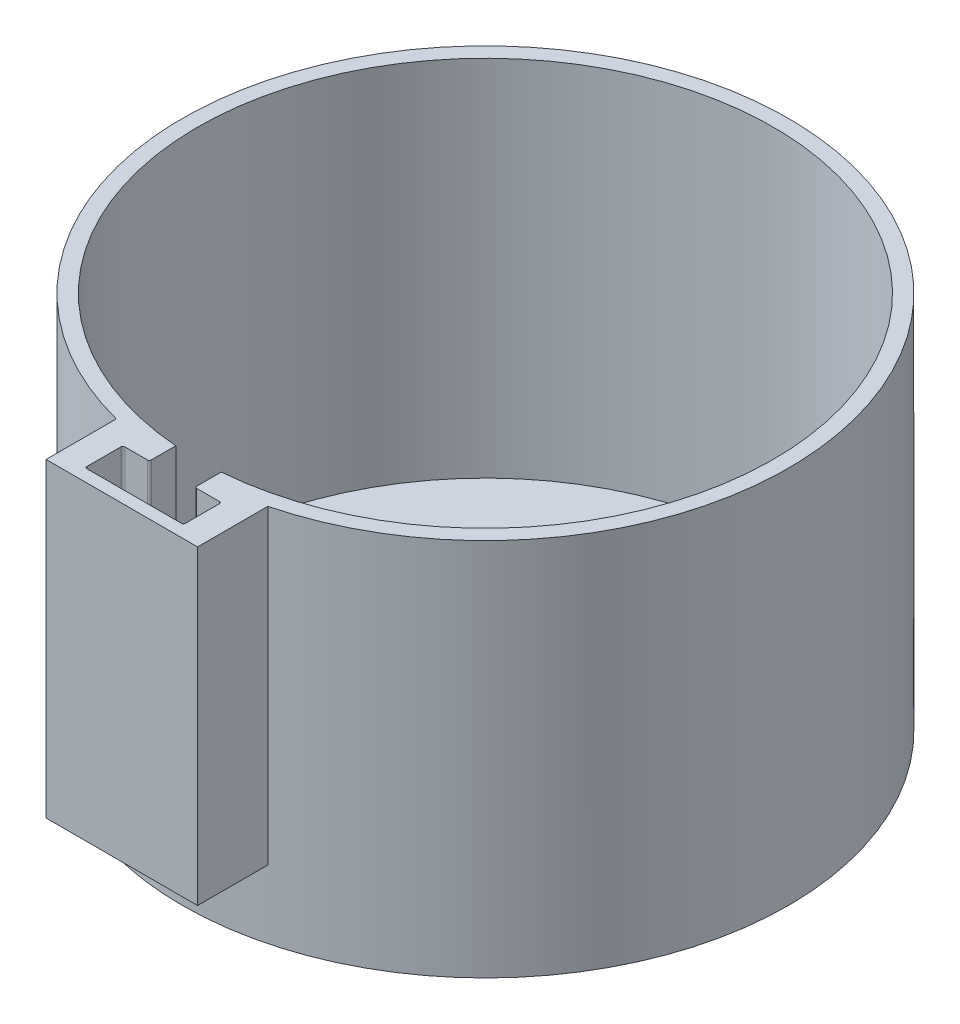
ISO-10303-21;
HEADER;
FILE_DESCRIPTION(('STEP AP214'),'2;1');
FILE_NAME('part.step','',(''),(''),'','','');
FILE_SCHEMA(('AUTOMOTIVE_DESIGN { 1 0 10303 214 1 1 1 1 }'));
ENDSEC;
DATA;
#1=APPLICATION_CONTEXT('core data for automotive mechanical design processes');
#2=APPLICATION_PROTOCOL_DEFINITION('international standard','automotive_design',2000,#1);
#3=PRODUCT_CONTEXT('',#1,'mechanical');
#4=PRODUCT('Part','Part','',(#3));
#5=PRODUCT_RELATED_PRODUCT_CATEGORY('part','',(#4));
#6=PRODUCT_DEFINITION_FORMATION('','',#4);
#7=PRODUCT_DEFINITION_CONTEXT('part definition',#1,'design');
#8=PRODUCT_DEFINITION('design','',#6,#7);
#9=PRODUCT_DEFINITION_SHAPE('','',#8);
#10=(LENGTH_UNIT() NAMED_UNIT(*) SI_UNIT(.MILLI.,.METRE.));
#11=(NAMED_UNIT(*) PLANE_ANGLE_UNIT() SI_UNIT($,.RADIAN.));
#12=(NAMED_UNIT(*) SI_UNIT($,.STERADIAN.) SOLID_ANGLE_UNIT());
#13=UNCERTAINTY_MEASURE_WITH_UNIT(LENGTH_MEASURE(1.E-05),#10,'distance_accuracy_value','');
#14=(GEOMETRIC_REPRESENTATION_CONTEXT(3) GLOBAL_UNCERTAINTY_ASSIGNED_CONTEXT((#13)) GLOBAL_UNIT_ASSIGNED_CONTEXT((#10,
#11,#12)) REPRESENTATION_CONTEXT('',''));
#15=CARTESIAN_POINT('',(0.,0.,0.));
#16=DIRECTION('',(0.,0.,1.));
#17=DIRECTION('',(1.,0.,0.));
#18=AXIS2_PLACEMENT_3D('',#15,#16,#17);
#19=CARTESIAN_POINT('',(0.,40.,0.));
#20=DIRECTION('',(0.,-1.,0.));
#21=DIRECTION('',(0.,0.,-1.));
#22=AXIS2_PLACEMENT_3D('',#19,#20,#21);
#23=CYLINDRICAL_SURFACE('',#22,40.);
#24=CARTESIAN_POINT('',(0.,0.,0.));
#25=DIRECTION('',(0.,1.,0.));
#26=DIRECTION('',(0.,0.,1.));
#27=AXIS2_PLACEMENT_3D('',#24,#25,#26);
#28=CIRCLE('',#27,40.);
#29=CARTESIAN_POINT('',(0.,0.,40.));
#30=VERTEX_POINT('',#29);
#31=EDGE_CURVE('E261',#30,#30,#28,.T.);
#32=ORIENTED_EDGE('',*,*,#31,.T.);
#33=EDGE_LOOP('',(#32));
#34=FACE_BOUND('',#33,.T.);
#35=DIRECTION('',(0.,-1.,0.));
#36=VECTOR('',#35,1.);
#37=CARTESIAN_POINT('',(10.,40.,38.7298334620742));
#38=LINE('',#37,#36);
#39=CARTESIAN_POINT('',(10.,9.,38.7298334620742));
#40=VERTEX_POINT('',#39);
#41=CARTESIAN_POINT('',(10.,50.,38.7298334620742));
#42=VERTEX_POINT('',#41);
#43=EDGE_CURVE('E228',#40,#42,#38,.F.);
#44=ORIENTED_EDGE('',*,*,#43,.F.);
#45=CARTESIAN_POINT('',(0.,9.,0.));
#46=DIRECTION('',(0.,-1.,0.));
#47=DIRECTION('',(0.,0.,-1.));
#48=AXIS2_PLACEMENT_3D('',#45,#46,#47);
#49=CIRCLE('',#48,40.);
#50=CARTESIAN_POINT('',(-9.99999999999999,9.,38.7298334620742));
#51=VERTEX_POINT('',#50);
#52=EDGE_CURVE('E220',#40,#51,#49,.T.);
#53=ORIENTED_EDGE('',*,*,#52,.T.);
#54=DIRECTION('',(0.,-1.,0.));
#55=VECTOR('',#54,1.);
#56=CARTESIAN_POINT('',(-9.99999999999999,40.,38.7298334620742));
#57=LINE('',#56,#55);
#58=CARTESIAN_POINT('',(-9.99999999999999,50.,38.7298334620742));
#59=VERTEX_POINT('',#58);
#60=EDGE_CURVE('E443',#51,#59,#57,.F.);
#61=ORIENTED_EDGE('',*,*,#60,.T.);
#62=CARTESIAN_POINT('',(0.,50.,0.));
#63=DIRECTION('',(0.,1.,0.));
#64=DIRECTION('',(0.,0.,1.));
#65=AXIS2_PLACEMENT_3D('',#62,#63,#64);
#66=CIRCLE('',#65,40.);
#67=EDGE_CURVE('E219',#42,#59,#66,.T.);
#68=ORIENTED_EDGE('',*,*,#67,.F.);
#69=EDGE_LOOP('',(#44,#53,#61,#68));
#70=FACE_BOUND('',#69,.T.);
#71=ADVANCED_FACE('F45',(#34,#70),#23,.T.);
#72=CARTESIAN_POINT('',(0.,0.,0.));
#73=DIRECTION('',(0.,1.,0.));
#74=DIRECTION('',(0.,0.,1.));
#75=AXIS2_PLACEMENT_3D('',#72,#73,#74);
#76=PLANE('',#75);
#77=CARTESIAN_POINT('',(-30.,0.,0.));
#78=DIRECTION('',(0.,-1.,0.));
#79=DIRECTION('',(0.,0.,-1.));
#80=AXIS2_PLACEMENT_3D('',#77,#78,#79);
#81=CIRCLE('',#80,3.);
#82=CARTESIAN_POINT('',(-30.,0.,-3.));
#83=VERTEX_POINT('',#82);
#84=EDGE_CURVE('E357',#83,#83,#81,.T.);
#85=ORIENTED_EDGE('',*,*,#84,.F.);
#86=EDGE_LOOP('',(#85));
#87=FACE_BOUND('',#86,.T.);
#88=CARTESIAN_POINT('',(30.,0.,0.));
#89=DIRECTION('',(0.,-1.,0.));
#90=DIRECTION('',(0.,0.,-1.));
#91=AXIS2_PLACEMENT_3D('',#88,#89,#90);
#92=CIRCLE('',#91,3.);
#93=CARTESIAN_POINT('',(30.,0.,-3.));
#94=VERTEX_POINT('',#93);
#95=EDGE_CURVE('E365',#94,#94,#92,.T.);
#96=ORIENTED_EDGE('',*,*,#95,.F.);
#97=EDGE_LOOP('',(#96));
#98=FACE_BOUND('',#97,.T.);
#99=CARTESIAN_POINT('',(-20.,0.,0.));
#100=DIRECTION('',(0.,1.,0.));
#101=DIRECTION('',(0.,0.,1.));
#102=AXIS2_PLACEMENT_3D('',#99,#100,#101);
#103=CIRCLE('',#102,2.);
#104=CARTESIAN_POINT('',(-20.,0.,2.));
#105=VERTEX_POINT('',#104);
#106=EDGE_CURVE('E277',#105,#105,#103,.F.);
#107=ORIENTED_EDGE('',*,*,#106,.F.);
#108=EDGE_LOOP('',(#107));
#109=FACE_BOUND('',#108,.T.);
#110=CARTESIAN_POINT('',(20.,0.,0.));
#111=DIRECTION('',(0.,1.,0.));
#112=DIRECTION('',(0.,0.,1.));
#113=AXIS2_PLACEMENT_3D('',#110,#111,#112);
#114=CIRCLE('',#113,2.);
#115=CARTESIAN_POINT('',(20.,0.,2.));
#116=VERTEX_POINT('',#115);
#117=EDGE_CURVE('E273',#116,#116,#114,.F.);
#118=ORIENTED_EDGE('',*,*,#117,.F.);
#119=EDGE_LOOP('',(#118));
#120=FACE_BOUND('',#119,.T.);
#121=CARTESIAN_POINT('',(0.,0.,0.));
#122=DIRECTION('',(0.,1.,0.));
#123=DIRECTION('',(0.,0.,1.));
#124=AXIS2_PLACEMENT_3D('',#121,#122,#123);
#125=CIRCLE('',#124,5.);
#126=CARTESIAN_POINT('',(0.,0.,5.));
#127=VERTEX_POINT('',#126);
#128=EDGE_CURVE('E243',#127,#127,#125,.T.);
#129=ORIENTED_EDGE('',*,*,#128,.T.);
#130=EDGE_LOOP('',(#129));
#131=FACE_BOUND('',#130,.T.);
#132=CARTESIAN_POINT('',(0.,0.,39.1212194390183));
#133=DIRECTION('',(0.,1.,0.));
#134=DIRECTION('',(0.,0.,1.));
#135=AXIS2_PLACEMENT_3D('',#132,#133,#134);
#136=CIRCLE('',#135,14.5863569862894);
#137=CARTESIAN_POINT('',(14.0760667026475,0.,35.296803625578));
#138=VERTEX_POINT('',#137);
#139=CARTESIAN_POINT('',(-14.0760667026475,0.,35.296803625578));
#140=VERTEX_POINT('',#139);
#141=EDGE_CURVE('E265',#138,#140,#136,.T.);
#142=ORIENTED_EDGE('',*,*,#141,.T.);
#143=CARTESIAN_POINT('',(0.,0.,4.02455846426619E-13));
#144=DIRECTION('',(0.,1.,0.));
#145=DIRECTION('',(0.,0.,1.));
#146=AXIS2_PLACEMENT_3D('',#143,#144,#145);
#147=CIRCLE('',#146,37.9999999999996);
#148=EDGE_CURVE('E269',#140,#138,#147,.T.);
#149=ORIENTED_EDGE('',*,*,#148,.T.);
#150=EDGE_LOOP('',(#142,#149));
#151=FACE_BOUND('',#150,.T.);
#152=ORIENTED_EDGE('',*,*,#31,.F.);
#153=EDGE_LOOP('',(#152));
#154=FACE_BOUND('',#153,.T.);
#155=ADVANCED_FACE('F476',(#87,#98,#109,#120,#131,#151,#154),#76,.F.);
#156=CARTESIAN_POINT('',(0.,2.,0.));
#157=DIRECTION('',(0.,1.,0.));
#158=DIRECTION('',(0.,0.,1.));
#159=AXIS2_PLACEMENT_3D('',#156,#157,#158);
#160=CYLINDRICAL_SURFACE('',#159,38.);
#161=CARTESIAN_POINT('',(0.,50.,0.));
#162=DIRECTION('',(0.,1.,0.));
#163=DIRECTION('',(0.,0.,1.));
#164=AXIS2_PLACEMENT_3D('',#161,#162,#163);
#165=CIRCLE('',#164,38.);
#166=CARTESIAN_POINT('',(3.,50.,37.8813938497516));
#167=VERTEX_POINT('',#166);
#168=CARTESIAN_POINT('',(-3.,50.,37.8813938497516));
#169=VERTEX_POINT('',#168);
#170=EDGE_CURVE('E206',#167,#169,#165,.T.);
#171=ORIENTED_EDGE('',*,*,#170,.T.);
#172=DIRECTION('',(0.,1.,0.));
#173=VECTOR('',#172,1.);
#174=CARTESIAN_POINT('',(-3.,2.,37.8813938497516));
#175=LINE('',#174,#173);
#176=CARTESIAN_POINT('',(-3.,11.,37.8813938497516));
#177=VERTEX_POINT('',#176);
#178=EDGE_CURVE('E209',#169,#177,#175,.F.);
#179=ORIENTED_EDGE('',*,*,#178,.T.);
#180=CARTESIAN_POINT('',(0.,11.,0.));
#181=DIRECTION('',(0.,-1.,0.));
#182=DIRECTION('',(0.,0.,-1.));
#183=AXIS2_PLACEMENT_3D('',#180,#181,#182);
#184=CIRCLE('',#183,38.);
#185=CARTESIAN_POINT('',(3.,11.,37.8813938497516));
#186=VERTEX_POINT('',#185);
#187=EDGE_CURVE('E207',#177,#186,#184,.F.);
#188=ORIENTED_EDGE('',*,*,#187,.T.);
#189=DIRECTION('',(0.,1.,0.));
#190=VECTOR('',#189,1.);
#191=CARTESIAN_POINT('',(3.,2.,37.8813938497516));
#192=LINE('',#191,#190);
#193=EDGE_CURVE('E191',#186,#167,#192,.T.);
#194=ORIENTED_EDGE('',*,*,#193,.T.);
#195=EDGE_LOOP('',(#171,#179,#188,#194));
#196=FACE_BOUND('',#195,.T.);
#197=CARTESIAN_POINT('',(0.,2.,0.));
#198=DIRECTION('',(0.,1.,0.));
#199=DIRECTION('',(0.,0.,1.));
#200=AXIS2_PLACEMENT_3D('',#197,#198,#199);
#201=CIRCLE('',#200,38.);
#202=CARTESIAN_POINT('',(14.0760667026475,2.,35.296803625578));
#203=VERTEX_POINT('',#202);
#204=CARTESIAN_POINT('',(-14.0760667026475,2.,35.296803625578));
#205=VERTEX_POINT('',#204);
#206=EDGE_CURVE('E255',#203,#205,#201,.T.);
#207=ORIENTED_EDGE('',*,*,#206,.F.);
#208=DIRECTION('',(0.,1.,0.));
#209=VECTOR('',#208,1.);
#210=CARTESIAN_POINT('',(14.0760667026475,-36.,35.296803625578));
#211=LINE('',#210,#209);
#212=EDGE_CURVE('E251',#138,#203,#211,.T.);
#213=ORIENTED_EDGE('',*,*,#212,.F.);
#214=ORIENTED_EDGE('',*,*,#148,.F.);
#215=DIRECTION('',(0.,1.,0.));
#216=VECTOR('',#215,1.);
#217=CARTESIAN_POINT('',(-14.0760667026475,-36.,35.296803625578));
#218=LINE('',#217,#216);
#219=EDGE_CURVE('E252',#140,#205,#218,.T.);
#220=ORIENTED_EDGE('',*,*,#219,.T.);
#221=EDGE_LOOP('',(#207,#213,#214,#220));
#222=FACE_BOUND('',#221,.T.);
#223=ADVANCED_FACE('F203',(#196,#222),#160,.F.);
#224=CARTESIAN_POINT('',(0.,2.,0.));
#225=DIRECTION('',(0.,1.,0.));
#226=DIRECTION('',(0.,0.,1.));
#227=AXIS2_PLACEMENT_3D('',#224,#225,#226);
#228=PLANE('',#227);
#229=CARTESIAN_POINT('',(-30.,2.,0.));
#230=DIRECTION('',(0.,1.,0.));
#231=DIRECTION('',(0.,0.,1.));
#232=AXIS2_PLACEMENT_3D('',#229,#230,#231);
#233=CIRCLE('',#232,3.);
#234=CARTESIAN_POINT('',(-30.,2.,3.));
#235=VERTEX_POINT('',#234);
#236=EDGE_CURVE('E49',#235,#235,#233,.T.);
#237=ORIENTED_EDGE('',*,*,#236,.F.);
#238=EDGE_LOOP('',(#237));
#239=FACE_BOUND('',#238,.T.);
#240=CARTESIAN_POINT('',(30.,2.,0.));
#241=DIRECTION('',(0.,1.,0.));
#242=DIRECTION('',(0.,0.,1.));
#243=AXIS2_PLACEMENT_3D('',#240,#241,#242);
#244=CIRCLE('',#243,3.);
#245=CARTESIAN_POINT('',(30.,2.,3.));
#246=VERTEX_POINT('',#245);
#247=EDGE_CURVE('E354',#246,#246,#244,.T.);
#248=ORIENTED_EDGE('',*,*,#247,.F.);
#249=EDGE_LOOP('',(#248));
#250=FACE_BOUND('',#249,.T.);
#251=CARTESIAN_POINT('',(0.,2.,0.));
#252=DIRECTION('',(0.,1.,0.));
#253=DIRECTION('',(0.,0.,1.));
#254=AXIS2_PLACEMENT_3D('',#251,#252,#253);
#255=CIRCLE('',#254,5.);
#256=CARTESIAN_POINT('',(0.,2.,5.));
#257=VERTEX_POINT('',#256);
#258=EDGE_CURVE('E236',#257,#257,#255,.T.);
#259=ORIENTED_EDGE('',*,*,#258,.F.);
#260=EDGE_LOOP('',(#259));
#261=FACE_BOUND('',#260,.T.);
#262=CARTESIAN_POINT('',(0.,2.,39.1212194390183));
#263=DIRECTION('',(0.,1.,0.));
#264=DIRECTION('',(0.,0.,-1.));
#265=AXIS2_PLACEMENT_3D('',#262,#263,#264);
#266=CIRCLE('',#265,14.5863569862894);
#267=EDGE_CURVE('E247',#203,#205,#266,.T.);
#268=ORIENTED_EDGE('',*,*,#267,.F.);
#269=ORIENTED_EDGE('',*,*,#206,.T.);
#270=EDGE_LOOP('',(#268,#269));
#271=FACE_BOUND('',#270,.T.);
#272=ADVANCED_FACE('F587',(#239,#250,#261,#271),#228,.T.);
#273=CARTESIAN_POINT('',(0.,-36.,39.1212194390183));
#274=DIRECTION('',(0.,1.,0.));
#275=DIRECTION('',(0.,0.,1.));
#276=AXIS2_PLACEMENT_3D('',#273,#274,#275);
#277=CYLINDRICAL_SURFACE('',#276,14.5863569862894);
#278=ORIENTED_EDGE('',*,*,#212,.T.);
#279=ORIENTED_EDGE('',*,*,#267,.T.);
#280=ORIENTED_EDGE('',*,*,#219,.F.);
#281=ORIENTED_EDGE('',*,*,#141,.F.);
#282=EDGE_LOOP('',(#278,#279,#280,#281));
#283=FACE_BOUND('',#282,.T.);
#284=ADVANCED_FACE('F583',(#283),#277,.F.);
#285=CARTESIAN_POINT('',(0.,-36.,0.));
#286=DIRECTION('',(0.,1.,0.));
#287=DIRECTION('',(0.,0.,1.));
#288=AXIS2_PLACEMENT_3D('',#285,#286,#287);
#289=CYLINDRICAL_SURFACE('',#288,5.);
#290=ORIENTED_EDGE('',*,*,#258,.T.);
#291=EDGE_LOOP('',(#290));
#292=FACE_BOUND('',#291,.T.);
#293=ORIENTED_EDGE('',*,*,#128,.F.);
#294=EDGE_LOOP('',(#293));
#295=FACE_BOUND('',#294,.T.);
#296=ADVANCED_FACE('F576',(#292,#295),#289,.F.);
#297=CARTESIAN_POINT('',(20.,-2.,0.));
#298=DIRECTION('',(0.,1.,0.));
#299=DIRECTION('',(0.,0.,1.));
#300=AXIS2_PLACEMENT_3D('',#297,#298,#299);
#301=CYLINDRICAL_SURFACE('',#300,2.);
#302=CARTESIAN_POINT('',(20.,-2.,0.));
#303=DIRECTION('',(0.,-1.,0.));
#304=DIRECTION('',(0.,0.,-1.));
#305=AXIS2_PLACEMENT_3D('',#302,#303,#304);
#306=CIRCLE('',#305,2.);
#307=CARTESIAN_POINT('',(20.,-2.,-2.));
#308=VERTEX_POINT('',#307);
#309=EDGE_CURVE('E225',#308,#308,#306,.T.);
#310=ORIENTED_EDGE('',*,*,#309,.F.);
#311=EDGE_LOOP('',(#310));
#312=FACE_BOUND('',#311,.T.);
#313=ORIENTED_EDGE('',*,*,#117,.T.);
#314=EDGE_LOOP('',(#313));
#315=FACE_BOUND('',#314,.T.);
#316=ADVANCED_FACE('F573',(#312,#315),#301,.T.);
#317=CARTESIAN_POINT('',(20.,-2.,0.));
#318=DIRECTION('',(0.,-1.,0.));
#319=DIRECTION('',(0.,0.,-1.));
#320=AXIS2_PLACEMENT_3D('',#317,#318,#319);
#321=PLANE('',#320);
#322=ORIENTED_EDGE('',*,*,#309,.T.);
#323=EDGE_LOOP('',(#322));
#324=FACE_BOUND('',#323,.T.);
#325=ADVANCED_FACE('F571',(#324),#321,.T.);
#326=CARTESIAN_POINT('',(-20.,-2.,0.));
#327=DIRECTION('',(0.,1.,0.));
#328=DIRECTION('',(0.,0.,1.));
#329=AXIS2_PLACEMENT_3D('',#326,#327,#328);
#330=CYLINDRICAL_SURFACE('',#329,2.);
#331=CARTESIAN_POINT('',(-20.,-2.,0.));
#332=DIRECTION('',(0.,-1.,0.));
#333=DIRECTION('',(0.,0.,-1.));
#334=AXIS2_PLACEMENT_3D('',#331,#332,#333);
#335=CIRCLE('',#334,2.);
#336=CARTESIAN_POINT('',(-20.,-2.,-2.));
#337=VERTEX_POINT('',#336);
#338=EDGE_CURVE('E232',#337,#337,#335,.T.);
#339=ORIENTED_EDGE('',*,*,#338,.F.);
#340=EDGE_LOOP('',(#339));
#341=FACE_BOUND('',#340,.T.);
#342=ORIENTED_EDGE('',*,*,#106,.T.);
#343=EDGE_LOOP('',(#342));
#344=FACE_BOUND('',#343,.T.);
#345=ADVANCED_FACE('F565',(#341,#344),#330,.T.);
#346=CARTESIAN_POINT('',(-20.,-2.,0.));
#347=DIRECTION('',(0.,-1.,0.));
#348=DIRECTION('',(0.,0.,-1.));
#349=AXIS2_PLACEMENT_3D('',#346,#347,#348);
#350=PLANE('',#349);
#351=ORIENTED_EDGE('',*,*,#338,.T.);
#352=EDGE_LOOP('',(#351));
#353=FACE_BOUND('',#352,.T.);
#354=ADVANCED_FACE('F559',(#353),#350,.T.);
#355=CARTESIAN_POINT('',(0.,50.,0.));
#356=DIRECTION('',(0.,1.,0.));
#357=DIRECTION('',(0.,0.,1.));
#358=AXIS2_PLACEMENT_3D('',#355,#356,#357);
#359=PLANE('',#358);
#360=DIRECTION('',(-1.,0.,0.));
#361=VECTOR('',#360,1.);
#362=CARTESIAN_POINT('',(-3.,50.,41.3649167310371));
#363=LINE('',#362,#361);
#364=CARTESIAN_POINT('',(-3.25,50.,41.3649167310371));
#365=VERTEX_POINT('',#364);
#366=CARTESIAN_POINT('',(-6.25,50.,41.3649167310371));
#367=VERTEX_POINT('',#366);
#368=EDGE_CURVE('E198',#365,#367,#363,.T.);
#369=ORIENTED_EDGE('',*,*,#368,.F.);
#370=CARTESIAN_POINT('',(-3.25,50.,41.1149167310371));
#371=DIRECTION('',(0.,1.,0.));
#372=DIRECTION('',(0.,0.,1.));
#373=AXIS2_PLACEMENT_3D('',#370,#371,#372);
#374=CIRCLE('',#373,0.25);
#375=CARTESIAN_POINT('',(-3.,50.,41.1149167310371));
#376=VERTEX_POINT('',#375);
#377=EDGE_CURVE('E295',#365,#376,#374,.T.);
#378=ORIENTED_EDGE('',*,*,#377,.T.);
#379=DIRECTION('',(0.,0.,1.));
#380=VECTOR('',#379,1.);
#381=CARTESIAN_POINT('',(-3.,50.,0.));
#382=LINE('',#381,#380);
#383=EDGE_CURVE('E217',#169,#376,#382,.T.);
#384=ORIENTED_EDGE('',*,*,#383,.F.);
#385=ORIENTED_EDGE('',*,*,#170,.F.);
#386=DIRECTION('',(0.,0.,-1.));
#387=VECTOR('',#386,1.);
#388=CARTESIAN_POINT('',(3.,50.,36.8649167310371));
#389=LINE('',#388,#387);
#390=CARTESIAN_POINT('',(3.,50.,41.1149167310371));
#391=VERTEX_POINT('',#390);
#392=EDGE_CURVE('E187',#391,#167,#389,.T.);
#393=ORIENTED_EDGE('',*,*,#392,.F.);
#394=CARTESIAN_POINT('',(3.25,50.,41.1149167310371));
#395=DIRECTION('',(0.,1.,0.));
#396=DIRECTION('',(0.,0.,1.));
#397=AXIS2_PLACEMENT_3D('',#394,#395,#396);
#398=CIRCLE('',#397,0.25);
#399=CARTESIAN_POINT('',(3.25,50.,41.3649167310371));
#400=VERTEX_POINT('',#399);
#401=EDGE_CURVE('E292',#391,#400,#398,.T.);
#402=ORIENTED_EDGE('',*,*,#401,.T.);
#403=DIRECTION('',(-1.,0.,0.));
#404=VECTOR('',#403,1.);
#405=CARTESIAN_POINT('',(3.,50.,41.3649167310371));
#406=LINE('',#405,#404);
#407=CARTESIAN_POINT('',(6.25,50.,41.3649167310371));
#408=VERTEX_POINT('',#407);
#409=EDGE_CURVE('E199',#408,#400,#406,.T.);
#410=ORIENTED_EDGE('',*,*,#409,.F.);
#411=CARTESIAN_POINT('',(6.25,50.,41.6149167310371));
#412=DIRECTION('',(0.,1.,0.));
#413=DIRECTION('',(0.,0.,1.));
#414=AXIS2_PLACEMENT_3D('',#411,#412,#413);
#415=CIRCLE('',#414,0.25);
#416=CARTESIAN_POINT('',(6.5,50.,41.6149167310371));
#417=VERTEX_POINT('',#416);
#418=EDGE_CURVE('E347',#408,#417,#415,.F.);
#419=ORIENTED_EDGE('',*,*,#418,.T.);
#420=DIRECTION('',(0.,0.,-1.));
#421=VECTOR('',#420,1.);
#422=CARTESIAN_POINT('',(6.5,50.,41.3649167310371));
#423=LINE('',#422,#421);
#424=CARTESIAN_POINT('',(6.50000000000001,50.,46.1149167310371));
#425=VERTEX_POINT('',#424);
#426=EDGE_CURVE('E400',#425,#417,#423,.T.);
#427=ORIENTED_EDGE('',*,*,#426,.F.);
#428=CARTESIAN_POINT('',(6.25,50.,46.1149167310371));
#429=DIRECTION('',(0.,1.,0.));
#430=DIRECTION('',(0.,0.,1.));
#431=AXIS2_PLACEMENT_3D('',#428,#429,#430);
#432=CIRCLE('',#431,0.25);
#433=CARTESIAN_POINT('',(6.25,50.,46.3649167310371));
#434=VERTEX_POINT('',#433);
#435=EDGE_CURVE('E55',#425,#434,#432,.F.);
#436=ORIENTED_EDGE('',*,*,#435,.T.);
#437=DIRECTION('',(1.,0.,0.));
#438=VECTOR('',#437,1.);
#439=CARTESIAN_POINT('',(-6.5,50.,46.3649167310371));
#440=LINE('',#439,#438);
#441=CARTESIAN_POINT('',(-6.25,50.,46.3649167310371));
#442=VERTEX_POINT('',#441);
#443=EDGE_CURVE('E363',#442,#434,#440,.T.);
#444=ORIENTED_EDGE('',*,*,#443,.F.);
#445=CARTESIAN_POINT('',(-6.25,50.,46.1149167310371));
#446=DIRECTION('',(0.,1.,0.));
#447=DIRECTION('',(0.,0.,1.));
#448=AXIS2_PLACEMENT_3D('',#445,#446,#447);
#449=CIRCLE('',#448,0.25);
#450=CARTESIAN_POINT('',(-6.5,50.,46.1149167310371));
#451=VERTEX_POINT('',#450);
#452=EDGE_CURVE('E11',#442,#451,#449,.F.);
#453=ORIENTED_EDGE('',*,*,#452,.T.);
#454=DIRECTION('',(0.,0.,1.));
#455=VECTOR('',#454,1.);
#456=CARTESIAN_POINT('',(-6.5,50.,41.3649167310371));
#457=LINE('',#456,#455);
#458=CARTESIAN_POINT('',(-6.5,50.,41.6149167310371));
#459=VERTEX_POINT('',#458);
#460=EDGE_CURVE('E377',#459,#451,#457,.T.);
#461=ORIENTED_EDGE('',*,*,#460,.F.);
#462=CARTESIAN_POINT('',(-6.25,50.,41.6149167310371));
#463=DIRECTION('',(0.,1.,0.));
#464=DIRECTION('',(0.,0.,1.));
#465=AXIS2_PLACEMENT_3D('',#462,#463,#464);
#466=CIRCLE('',#465,0.25);
#467=EDGE_CURVE('E350',#459,#367,#466,.F.);
#468=ORIENTED_EDGE('',*,*,#467,.T.);
#469=EDGE_LOOP('',(#369,#378,#384,#385,#393,#402,#410,#419,#427,#436,#444,#453,#461,#468));
#470=FACE_BOUND('',#469,.T.);
#471=ORIENTED_EDGE('',*,*,#67,.T.);
#472=DIRECTION('',(0.,0.,1.));
#473=VECTOR('',#472,1.);
#474=CARTESIAN_POINT('',(-9.99999999999999,50.,38.));
#475=LINE('',#474,#473);
#476=CARTESIAN_POINT('',(-9.99999999999999,50.,48.));
#477=VERTEX_POINT('',#476);
#478=EDGE_CURVE('E420',#59,#477,#475,.T.);
#479=ORIENTED_EDGE('',*,*,#478,.T.);
#480=DIRECTION('',(1.,0.,0.));
#481=VECTOR('',#480,1.);
#482=CARTESIAN_POINT('',(-9.99999999999999,50.,48.));
#483=LINE('',#482,#481);
#484=CARTESIAN_POINT('',(10.,50.,48.));
#485=VERTEX_POINT('',#484);
#486=EDGE_CURVE('E430',#477,#485,#483,.T.);
#487=ORIENTED_EDGE('',*,*,#486,.T.);
#488=DIRECTION('',(0.,0.,1.));
#489=VECTOR('',#488,1.);
#490=CARTESIAN_POINT('',(10.,50.,38.));
#491=LINE('',#490,#489);
#492=EDGE_CURVE('E415',#42,#485,#491,.T.);
#493=ORIENTED_EDGE('',*,*,#492,.F.);
#494=EDGE_LOOP('',(#471,#479,#487,#493));
#495=FACE_BOUND('',#494,.T.);
#496=ADVANCED_FACE('F214',(#470,#495),#359,.T.);
#497=CARTESIAN_POINT('',(0.,9.,0.));
#498=DIRECTION('',(0.,-1.,0.));
#499=DIRECTION('',(0.,0.,-1.));
#500=AXIS2_PLACEMENT_3D('',#497,#498,#499);
#501=PLANE('',#500);
#502=ORIENTED_EDGE('',*,*,#52,.F.);
#503=DIRECTION('',(0.,0.,1.));
#504=VECTOR('',#503,1.);
#505=CARTESIAN_POINT('',(10.,9.,38.));
#506=LINE('',#505,#504);
#507=CARTESIAN_POINT('',(10.,9.,48.));
#508=VERTEX_POINT('',#507);
#509=EDGE_CURVE('E416',#40,#508,#506,.T.);
#510=ORIENTED_EDGE('',*,*,#509,.T.);
#511=DIRECTION('',(1.,0.,0.));
#512=VECTOR('',#511,1.);
#513=CARTESIAN_POINT('',(-9.99999999999999,9.,48.));
#514=LINE('',#513,#512);
#515=CARTESIAN_POINT('',(-9.99999999999999,9.,48.));
#516=VERTEX_POINT('',#515);
#517=EDGE_CURVE('E419',#516,#508,#514,.T.);
#518=ORIENTED_EDGE('',*,*,#517,.F.);
#519=DIRECTION('',(0.,0.,1.));
#520=VECTOR('',#519,1.);
#521=CARTESIAN_POINT('',(-9.99999999999999,9.,38.));
#522=LINE('',#521,#520);
#523=EDGE_CURVE('E424',#51,#516,#522,.T.);
#524=ORIENTED_EDGE('',*,*,#523,.F.);
#525=EDGE_LOOP('',(#502,#510,#518,#524));
#526=FACE_BOUND('',#525,.T.);
#527=ADVANCED_FACE('F462',(#526),#501,.T.);
#528=CARTESIAN_POINT('',(10.,9.,38.));
#529=DIRECTION('',(-1.,0.,0.));
#530=DIRECTION('',(0.,0.,1.));
#531=AXIS2_PLACEMENT_3D('',#528,#529,#530);
#532=PLANE('',#531);
#533=ORIENTED_EDGE('',*,*,#509,.F.);
#534=ORIENTED_EDGE('',*,*,#43,.T.);
#535=ORIENTED_EDGE('',*,*,#492,.T.);
#536=DIRECTION('',(0.,1.,0.));
#537=VECTOR('',#536,1.);
#538=CARTESIAN_POINT('',(10.,9.,48.));
#539=LINE('',#538,#537);
#540=EDGE_CURVE('E439',#508,#485,#539,.T.);
#541=ORIENTED_EDGE('',*,*,#540,.F.);
#542=EDGE_LOOP('',(#533,#534,#535,#541));
#543=FACE_BOUND('',#542,.T.);
#544=ADVANCED_FACE('F452',(#543),#532,.F.);
#545=CARTESIAN_POINT('',(-9.99999999999999,9.,38.));
#546=DIRECTION('',(-1.,0.,0.));
#547=DIRECTION('',(0.,0.,1.));
#548=AXIS2_PLACEMENT_3D('',#545,#546,#547);
#549=PLANE('',#548);
#550=ORIENTED_EDGE('',*,*,#60,.F.);
#551=ORIENTED_EDGE('',*,*,#523,.T.);
#552=DIRECTION('',(0.,1.,0.));
#553=VECTOR('',#552,1.);
#554=CARTESIAN_POINT('',(-9.99999999999999,9.,48.));
#555=LINE('',#554,#553);
#556=EDGE_CURVE('E427',#516,#477,#555,.T.);
#557=ORIENTED_EDGE('',*,*,#556,.T.);
#558=ORIENTED_EDGE('',*,*,#478,.F.);
#559=EDGE_LOOP('',(#550,#551,#557,#558));
#560=FACE_BOUND('',#559,.T.);
#561=ADVANCED_FACE('F464',(#560),#549,.T.);
#562=CARTESIAN_POINT('',(-9.99999999999999,9.,48.));
#563=DIRECTION('',(0.,0.,1.));
#564=DIRECTION('',(1.,0.,0.));
#565=AXIS2_PLACEMENT_3D('',#562,#563,#564);
#566=PLANE('',#565);
#567=ORIENTED_EDGE('',*,*,#486,.F.);
#568=ORIENTED_EDGE('',*,*,#556,.F.);
#569=ORIENTED_EDGE('',*,*,#517,.T.);
#570=ORIENTED_EDGE('',*,*,#540,.T.);
#571=EDGE_LOOP('',(#567,#568,#569,#570));
#572=FACE_BOUND('',#571,.T.);
#573=ADVANCED_FACE('F458',(#572),#566,.T.);
#574=CARTESIAN_POINT('',(0.,11.,0.));
#575=DIRECTION('',(0.,-1.,0.));
#576=DIRECTION('',(0.,0.,-1.));
#577=AXIS2_PLACEMENT_3D('',#574,#575,#576);
#578=PLANE('',#577);
#579=DIRECTION('',(0.,0.,-1.));
#580=VECTOR('',#579,1.);
#581=CARTESIAN_POINT('',(6.5,11.,41.3649167310371));
#582=LINE('',#581,#580);
#583=CARTESIAN_POINT('',(6.50000000000001,11.,46.1149167310371));
#584=VERTEX_POINT('',#583);
#585=CARTESIAN_POINT('',(6.5,11.,41.6149167310371));
#586=VERTEX_POINT('',#585);
#587=EDGE_CURVE('E376',#584,#586,#582,.T.);
#588=ORIENTED_EDGE('',*,*,#587,.T.);
#589=CARTESIAN_POINT('',(6.25,11.,41.6149167310371));
#590=DIRECTION('',(0.,-1.,0.));
#591=DIRECTION('',(0.,0.,-1.));
#592=AXIS2_PLACEMENT_3D('',#589,#590,#591);
#593=CIRCLE('',#592,0.25);
#594=CARTESIAN_POINT('',(6.25,11.,41.3649167310371));
#595=VERTEX_POINT('',#594);
#596=EDGE_CURVE('E325',#586,#595,#593,.F.);
#597=ORIENTED_EDGE('',*,*,#596,.T.);
#598=DIRECTION('',(-1.,0.,0.));
#599=VECTOR('',#598,1.);
#600=CARTESIAN_POINT('',(3.,11.,41.3649167310371));
#601=LINE('',#600,#599);
#602=CARTESIAN_POINT('',(3.25,11.,41.3649167310371));
#603=VERTEX_POINT('',#602);
#604=EDGE_CURVE('E381',#595,#603,#601,.T.);
#605=ORIENTED_EDGE('',*,*,#604,.T.);
#606=CARTESIAN_POINT('',(3.25,11.,41.1149167310371));
#607=DIRECTION('',(0.,-1.,0.));
#608=DIRECTION('',(0.,0.,-1.));
#609=AXIS2_PLACEMENT_3D('',#606,#607,#608);
#610=CIRCLE('',#609,0.25);
#611=CARTESIAN_POINT('',(3.,11.,41.1149167310371));
#612=VERTEX_POINT('',#611);
#613=EDGE_CURVE('E344',#603,#612,#610,.T.);
#614=ORIENTED_EDGE('',*,*,#613,.T.);
#615=DIRECTION('',(0.,0.,-1.));
#616=VECTOR('',#615,1.);
#617=CARTESIAN_POINT('',(3.,11.,36.8649167310371));
#618=LINE('',#617,#616);
#619=EDGE_CURVE('E385',#612,#186,#618,.T.);
#620=ORIENTED_EDGE('',*,*,#619,.T.);
#621=ORIENTED_EDGE('',*,*,#187,.F.);
#622=DIRECTION('',(0.,0.,1.));
#623=VECTOR('',#622,1.);
#624=CARTESIAN_POINT('',(-3.,11.,36.8649167310371));
#625=LINE('',#624,#623);
#626=CARTESIAN_POINT('',(-3.,11.,41.1149167310371));
#627=VERTEX_POINT('',#626);
#628=EDGE_CURVE('E388',#177,#627,#625,.T.);
#629=ORIENTED_EDGE('',*,*,#628,.T.);
#630=CARTESIAN_POINT('',(-3.25,11.,41.1149167310371));
#631=DIRECTION('',(0.,-1.,0.));
#632=DIRECTION('',(0.,0.,-1.));
#633=AXIS2_PLACEMENT_3D('',#630,#631,#632);
#634=CIRCLE('',#633,0.25);
#635=CARTESIAN_POINT('',(-3.25,11.,41.3649167310371));
#636=VERTEX_POINT('',#635);
#637=EDGE_CURVE('E341',#627,#636,#634,.T.);
#638=ORIENTED_EDGE('',*,*,#637,.T.);
#639=DIRECTION('',(-1.,0.,0.));
#640=VECTOR('',#639,1.);
#641=CARTESIAN_POINT('',(-3.,11.,41.3649167310371));
#642=LINE('',#641,#640);
#643=CARTESIAN_POINT('',(-6.25,11.,41.3649167310371));
#644=VERTEX_POINT('',#643);
#645=EDGE_CURVE('E392',#636,#644,#642,.T.);
#646=ORIENTED_EDGE('',*,*,#645,.T.);
#647=CARTESIAN_POINT('',(-6.25,11.,41.6149167310371));
#648=DIRECTION('',(0.,-1.,0.));
#649=DIRECTION('',(0.,0.,-1.));
#650=AXIS2_PLACEMENT_3D('',#647,#648,#649);
#651=CIRCLE('',#650,0.25);
#652=CARTESIAN_POINT('',(-6.5,11.,41.6149167310371));
#653=VERTEX_POINT('',#652);
#654=EDGE_CURVE('E322',#644,#653,#651,.F.);
#655=ORIENTED_EDGE('',*,*,#654,.T.);
#656=DIRECTION('',(0.,0.,1.));
#657=VECTOR('',#656,1.);
#658=CARTESIAN_POINT('',(-6.5,11.,41.3649167310371));
#659=LINE('',#658,#657);
#660=CARTESIAN_POINT('',(-6.5,11.,46.1149167310371));
#661=VERTEX_POINT('',#660);
#662=EDGE_CURVE('E210',#653,#661,#659,.T.);
#663=ORIENTED_EDGE('',*,*,#662,.T.);
#664=CARTESIAN_POINT('',(-6.25,11.,46.1149167310371));
#665=DIRECTION('',(0.,-1.,0.));
#666=DIRECTION('',(0.,0.,-1.));
#667=AXIS2_PLACEMENT_3D('',#664,#665,#666);
#668=CIRCLE('',#667,0.25);
#669=CARTESIAN_POINT('',(-6.25,11.,46.3649167310371));
#670=VERTEX_POINT('',#669);
#671=EDGE_CURVE('E70',#661,#670,#668,.F.);
#672=ORIENTED_EDGE('',*,*,#671,.T.);
#673=DIRECTION('',(1.,0.,0.));
#674=VECTOR('',#673,1.);
#675=CARTESIAN_POINT('',(-6.5,11.,46.3649167310371));
#676=LINE('',#675,#674);
#677=CARTESIAN_POINT('',(6.25,11.,46.3649167310371));
#678=VERTEX_POINT('',#677);
#679=EDGE_CURVE('E373',#670,#678,#676,.T.);
#680=ORIENTED_EDGE('',*,*,#679,.T.);
#681=CARTESIAN_POINT('',(6.25,11.,46.1149167310371));
#682=DIRECTION('',(0.,-1.,0.));
#683=DIRECTION('',(0.,0.,-1.));
#684=AXIS2_PLACEMENT_3D('',#681,#682,#683);
#685=CIRCLE('',#684,0.25);
#686=EDGE_CURVE('E319',#678,#584,#685,.F.);
#687=ORIENTED_EDGE('',*,*,#686,.T.);
#688=EDGE_LOOP('',(#588,#597,#605,#614,#620,#621,#629,#638,#646,#655,#663,#672,#680,#687));
#689=FACE_BOUND('',#688,.T.);
#690=ADVANCED_FACE('F471',(#689),#578,.F.);
#691=CARTESIAN_POINT('',(-3.,11.,36.8649167310371));
#692=DIRECTION('',(-1.,0.,0.));
#693=DIRECTION('',(0.,0.,1.));
#694=AXIS2_PLACEMENT_3D('',#691,#692,#693);
#695=PLANE('',#694);
#696=ORIENTED_EDGE('',*,*,#383,.T.);
#697=DIRECTION('',(0.,1.,0.));
#698=VECTOR('',#697,1.);
#699=CARTESIAN_POINT('',(-3.,11.,41.1149167310371));
#700=LINE('',#699,#698);
#701=EDGE_CURVE('E298',#376,#627,#700,.F.);
#702=ORIENTED_EDGE('',*,*,#701,.T.);
#703=ORIENTED_EDGE('',*,*,#628,.F.);
#704=ORIENTED_EDGE('',*,*,#178,.F.);
#705=EDGE_LOOP('',(#696,#702,#703,#704));
#706=FACE_BOUND('',#705,.T.);
#707=ADVANCED_FACE('F529',(#706),#695,.F.);
#708=CARTESIAN_POINT('',(3.,11.,36.8649167310371));
#709=DIRECTION('',(1.,0.,0.));
#710=DIRECTION('',(0.,0.,-1.));
#711=AXIS2_PLACEMENT_3D('',#708,#709,#710);
#712=PLANE('',#711);
#713=ORIENTED_EDGE('',*,*,#619,.F.);
#714=DIRECTION('',(0.,1.,0.));
#715=VECTOR('',#714,1.);
#716=CARTESIAN_POINT('',(3.,11.,41.1149167310371));
#717=LINE('',#716,#715);
#718=EDGE_CURVE('E194',#612,#391,#717,.T.);
#719=ORIENTED_EDGE('',*,*,#718,.T.);
#720=ORIENTED_EDGE('',*,*,#392,.T.);
#721=ORIENTED_EDGE('',*,*,#193,.F.);
#722=EDGE_LOOP('',(#713,#719,#720,#721));
#723=FACE_BOUND('',#722,.T.);
#724=ADVANCED_FACE('F190',(#723),#712,.F.);
#725=CARTESIAN_POINT('',(-6.5,11.,46.3649167310371));
#726=DIRECTION('',(0.,0.,1.));
#727=DIRECTION('',(1.,0.,0.));
#728=AXIS2_PLACEMENT_3D('',#725,#726,#727);
#729=PLANE('',#728);
#730=ORIENTED_EDGE('',*,*,#443,.T.);
#731=DIRECTION('',(0.,1.,0.));
#732=VECTOR('',#731,1.);
#733=CARTESIAN_POINT('',(6.25,11.,46.3649167310371));
#734=LINE('',#733,#732);
#735=EDGE_CURVE('E63',#434,#678,#734,.F.);
#736=ORIENTED_EDGE('',*,*,#735,.T.);
#737=ORIENTED_EDGE('',*,*,#679,.F.);
#738=DIRECTION('',(0.,1.,0.));
#739=VECTOR('',#738,1.);
#740=CARTESIAN_POINT('',(-6.25,50.,46.3649167310371));
#741=LINE('',#740,#739);
#742=EDGE_CURVE('E335',#670,#442,#741,.T.);
#743=ORIENTED_EDGE('',*,*,#742,.T.);
#744=EDGE_LOOP('',(#730,#736,#737,#743));
#745=FACE_BOUND('',#744,.T.);
#746=ADVANCED_FACE('F545',(#745),#729,.F.);
#747=CARTESIAN_POINT('',(-6.5,11.,41.3649167310371));
#748=DIRECTION('',(-1.,0.,0.));
#749=DIRECTION('',(0.,0.,1.));
#750=AXIS2_PLACEMENT_3D('',#747,#748,#749);
#751=PLANE('',#750);
#752=ORIENTED_EDGE('',*,*,#662,.F.);
#753=DIRECTION('',(0.,1.,0.));
#754=VECTOR('',#753,1.);
#755=CARTESIAN_POINT('',(-6.5,50.,41.6149167310371));
#756=LINE('',#755,#754);
#757=EDGE_CURVE('E331',#653,#459,#756,.T.);
#758=ORIENTED_EDGE('',*,*,#757,.T.);
#759=ORIENTED_EDGE('',*,*,#460,.T.);
#760=DIRECTION('',(0.,1.,0.));
#761=VECTOR('',#760,1.);
#762=CARTESIAN_POINT('',(-6.5,11.,46.1149167310371));
#763=LINE('',#762,#761);
#764=EDGE_CURVE('E328',#451,#661,#763,.F.);
#765=ORIENTED_EDGE('',*,*,#764,.T.);
#766=EDGE_LOOP('',(#752,#758,#759,#765));
#767=FACE_BOUND('',#766,.T.);
#768=ADVANCED_FACE('F540',(#767),#751,.F.);
#769=CARTESIAN_POINT('',(-3.,11.,41.3649167310371));
#770=DIRECTION('',(0.,0.,-1.));
#771=DIRECTION('',(-1.,0.,0.));
#772=AXIS2_PLACEMENT_3D('',#769,#770,#771);
#773=PLANE('',#772);
#774=ORIENTED_EDGE('',*,*,#645,.F.);
#775=DIRECTION('',(0.,1.,0.));
#776=VECTOR('',#775,1.);
#777=CARTESIAN_POINT('',(-3.25,11.,41.3649167310371));
#778=LINE('',#777,#776);
#779=EDGE_CURVE('E288',#636,#365,#778,.T.);
#780=ORIENTED_EDGE('',*,*,#779,.T.);
#781=ORIENTED_EDGE('',*,*,#368,.T.);
#782=DIRECTION('',(0.,1.,0.));
#783=VECTOR('',#782,1.);
#784=CARTESIAN_POINT('',(-6.25,11.,41.3649167310371));
#785=LINE('',#784,#783);
#786=EDGE_CURVE('E285',#367,#644,#785,.F.);
#787=ORIENTED_EDGE('',*,*,#786,.T.);
#788=EDGE_LOOP('',(#774,#780,#781,#787));
#789=FACE_BOUND('',#788,.T.);
#790=ADVANCED_FACE('F535',(#789),#773,.F.);
#791=CARTESIAN_POINT('',(3.,11.,41.3649167310371));
#792=DIRECTION('',(0.,0.,-1.));
#793=DIRECTION('',(-1.,0.,0.));
#794=AXIS2_PLACEMENT_3D('',#791,#792,#793);
#795=PLANE('',#794);
#796=ORIENTED_EDGE('',*,*,#409,.T.);
#797=DIRECTION('',(0.,1.,0.));
#798=VECTOR('',#797,1.);
#799=CARTESIAN_POINT('',(3.25,11.,41.3649167310371));
#800=LINE('',#799,#798);
#801=EDGE_CURVE('E307',#400,#603,#800,.F.);
#802=ORIENTED_EDGE('',*,*,#801,.T.);
#803=ORIENTED_EDGE('',*,*,#604,.F.);
#804=DIRECTION('',(0.,1.,0.));
#805=VECTOR('',#804,1.);
#806=CARTESIAN_POINT('',(6.25,50.,41.3649167310371));
#807=LINE('',#806,#805);
#808=EDGE_CURVE('E303',#595,#408,#807,.T.);
#809=ORIENTED_EDGE('',*,*,#808,.T.);
#810=EDGE_LOOP('',(#796,#802,#803,#809));
#811=FACE_BOUND('',#810,.T.);
#812=ADVANCED_FACE('F523',(#811),#795,.F.);
#813=CARTESIAN_POINT('',(6.5,11.,41.3649167310371));
#814=DIRECTION('',(1.,0.,0.));
#815=DIRECTION('',(0.,0.,-1.));
#816=AXIS2_PLACEMENT_3D('',#813,#814,#815);
#817=PLANE('',#816);
#818=ORIENTED_EDGE('',*,*,#426,.T.);
#819=DIRECTION('',(0.,1.,0.));
#820=VECTOR('',#819,1.);
#821=CARTESIAN_POINT('',(6.5,11.,41.6149167310371));
#822=LINE('',#821,#820);
#823=EDGE_CURVE('E314',#417,#586,#822,.F.);
#824=ORIENTED_EDGE('',*,*,#823,.T.);
#825=ORIENTED_EDGE('',*,*,#587,.F.);
#826=DIRECTION('',(0.,1.,0.));
#827=VECTOR('',#826,1.);
#828=CARTESIAN_POINT('',(6.50000000000001,50.,46.1149167310371));
#829=LINE('',#828,#827);
#830=EDGE_CURVE('E310',#584,#425,#829,.T.);
#831=ORIENTED_EDGE('',*,*,#830,.T.);
#832=EDGE_LOOP('',(#818,#824,#825,#831));
#833=FACE_BOUND('',#832,.T.);
#834=ADVANCED_FACE('F492',(#833),#817,.F.);
#835=CARTESIAN_POINT('',(-3.25,11.,41.1149167310371));
#836=DIRECTION('',(0.,1.,0.));
#837=DIRECTION('',(0.,0.,1.));
#838=AXIS2_PLACEMENT_3D('',#835,#836,#837);
#839=CYLINDRICAL_SURFACE('',#838,0.25);
#840=ORIENTED_EDGE('',*,*,#637,.F.);
#841=ORIENTED_EDGE('',*,*,#701,.F.);
#842=ORIENTED_EDGE('',*,*,#377,.F.);
#843=ORIENTED_EDGE('',*,*,#779,.F.);
#844=EDGE_LOOP('',(#840,#841,#842,#843));
#845=FACE_BOUND('',#844,.T.);
#846=ADVANCED_FACE('F488',(#845),#839,.T.);
#847=CARTESIAN_POINT('',(3.25,11.,41.1149167310371));
#848=DIRECTION('',(0.,1.,0.));
#849=DIRECTION('',(0.,0.,1.));
#850=AXIS2_PLACEMENT_3D('',#847,#848,#849);
#851=CYLINDRICAL_SURFACE('',#850,0.25);
#852=ORIENTED_EDGE('',*,*,#613,.F.);
#853=ORIENTED_EDGE('',*,*,#801,.F.);
#854=ORIENTED_EDGE('',*,*,#401,.F.);
#855=ORIENTED_EDGE('',*,*,#718,.F.);
#856=EDGE_LOOP('',(#852,#853,#854,#855));
#857=FACE_BOUND('',#856,.T.);
#858=ADVANCED_FACE('F491',(#857),#851,.T.);
#859=CARTESIAN_POINT('',(6.25,11.,41.6149167310371));
#860=DIRECTION('',(0.,-1.,0.));
#861=DIRECTION('',(0.,0.,-1.));
#862=AXIS2_PLACEMENT_3D('',#859,#860,#861);
#863=CYLINDRICAL_SURFACE('',#862,0.25);
#864=ORIENTED_EDGE('',*,*,#596,.F.);
#865=ORIENTED_EDGE('',*,*,#823,.F.);
#866=ORIENTED_EDGE('',*,*,#418,.F.);
#867=ORIENTED_EDGE('',*,*,#808,.F.);
#868=EDGE_LOOP('',(#864,#865,#866,#867));
#869=FACE_BOUND('',#868,.T.);
#870=ADVANCED_FACE('F496',(#869),#863,.F.);
#871=CARTESIAN_POINT('',(-6.25,11.,41.6149167310371));
#872=DIRECTION('',(0.,-1.,0.));
#873=DIRECTION('',(0.,0.,-1.));
#874=AXIS2_PLACEMENT_3D('',#871,#872,#873);
#875=CYLINDRICAL_SURFACE('',#874,0.25);
#876=ORIENTED_EDGE('',*,*,#654,.F.);
#877=ORIENTED_EDGE('',*,*,#786,.F.);
#878=ORIENTED_EDGE('',*,*,#467,.F.);
#879=ORIENTED_EDGE('',*,*,#757,.F.);
#880=EDGE_LOOP('',(#876,#877,#878,#879));
#881=FACE_BOUND('',#880,.T.);
#882=ADVANCED_FACE('F500',(#881),#875,.F.);
#883=CARTESIAN_POINT('',(6.25,11.,46.1149167310371));
#884=DIRECTION('',(0.,-1.,0.));
#885=DIRECTION('',(0.,0.,-1.));
#886=AXIS2_PLACEMENT_3D('',#883,#884,#885);
#887=CYLINDRICAL_SURFACE('',#886,0.25);
#888=ORIENTED_EDGE('',*,*,#686,.F.);
#889=ORIENTED_EDGE('',*,*,#735,.F.);
#890=ORIENTED_EDGE('',*,*,#435,.F.);
#891=ORIENTED_EDGE('',*,*,#830,.F.);
#892=EDGE_LOOP('',(#888,#889,#890,#891));
#893=FACE_BOUND('',#892,.T.);
#894=ADVANCED_FACE('F503',(#893),#887,.F.);
#895=CARTESIAN_POINT('',(-6.25,11.,46.1149167310371));
#896=DIRECTION('',(0.,-1.,0.));
#897=DIRECTION('',(0.,0.,-1.));
#898=AXIS2_PLACEMENT_3D('',#895,#896,#897);
#899=CYLINDRICAL_SURFACE('',#898,0.25);
#900=ORIENTED_EDGE('',*,*,#671,.F.);
#901=ORIENTED_EDGE('',*,*,#764,.F.);
#902=ORIENTED_EDGE('',*,*,#452,.F.);
#903=ORIENTED_EDGE('',*,*,#742,.F.);
#904=EDGE_LOOP('',(#900,#901,#902,#903));
#905=FACE_BOUND('',#904,.T.);
#906=ADVANCED_FACE('F47',(#905),#899,.F.);
#907=CARTESIAN_POINT('',(30.,10.,0.));
#908=DIRECTION('',(0.,-1.,0.));
#909=DIRECTION('',(0.,0.,-1.));
#910=AXIS2_PLACEMENT_3D('',#907,#908,#909);
#911=CYLINDRICAL_SURFACE('',#910,3.);
#912=ORIENTED_EDGE('',*,*,#247,.T.);
#913=EDGE_LOOP('',(#912));
#914=FACE_BOUND('',#913,.T.);
#915=ORIENTED_EDGE('',*,*,#95,.T.);
#916=EDGE_LOOP('',(#915));
#917=FACE_BOUND('',#916,.T.);
#918=ADVANCED_FACE('F510',(#914,#917),#911,.F.);
#919=CARTESIAN_POINT('',(-30.,10.,0.));
#920=DIRECTION('',(0.,-1.,0.));
#921=DIRECTION('',(0.,0.,-1.));
#922=AXIS2_PLACEMENT_3D('',#919,#920,#921);
#923=CYLINDRICAL_SURFACE('',#922,3.);
#924=ORIENTED_EDGE('',*,*,#236,.T.);
#925=EDGE_LOOP('',(#924));
#926=FACE_BOUND('',#925,.T.);
#927=ORIENTED_EDGE('',*,*,#84,.T.);
#928=EDGE_LOOP('',(#927));
#929=FACE_BOUND('',#928,.T.);
#930=ADVANCED_FACE('F701',(#926,#929),#923,.F.);
#931=CLOSED_SHELL('',(#71,#155,#223,#272,#284,#296,#316,#325,#345,#354,#496,#527,#544,#561,#573,
#690,#707,#724,#746,#768,#790,#812,#834,#846,#858,#870,#882,#894,#906,#918,#930));
#932=MANIFOLD_SOLID_BREP('B2',#931);
#933=ADVANCED_BREP_SHAPE_REPRESENTATION('',(#18,#932),#14);
#934=SHAPE_DEFINITION_REPRESENTATION(#9,#933);
ENDSEC;
END-ISO-10303-21;
